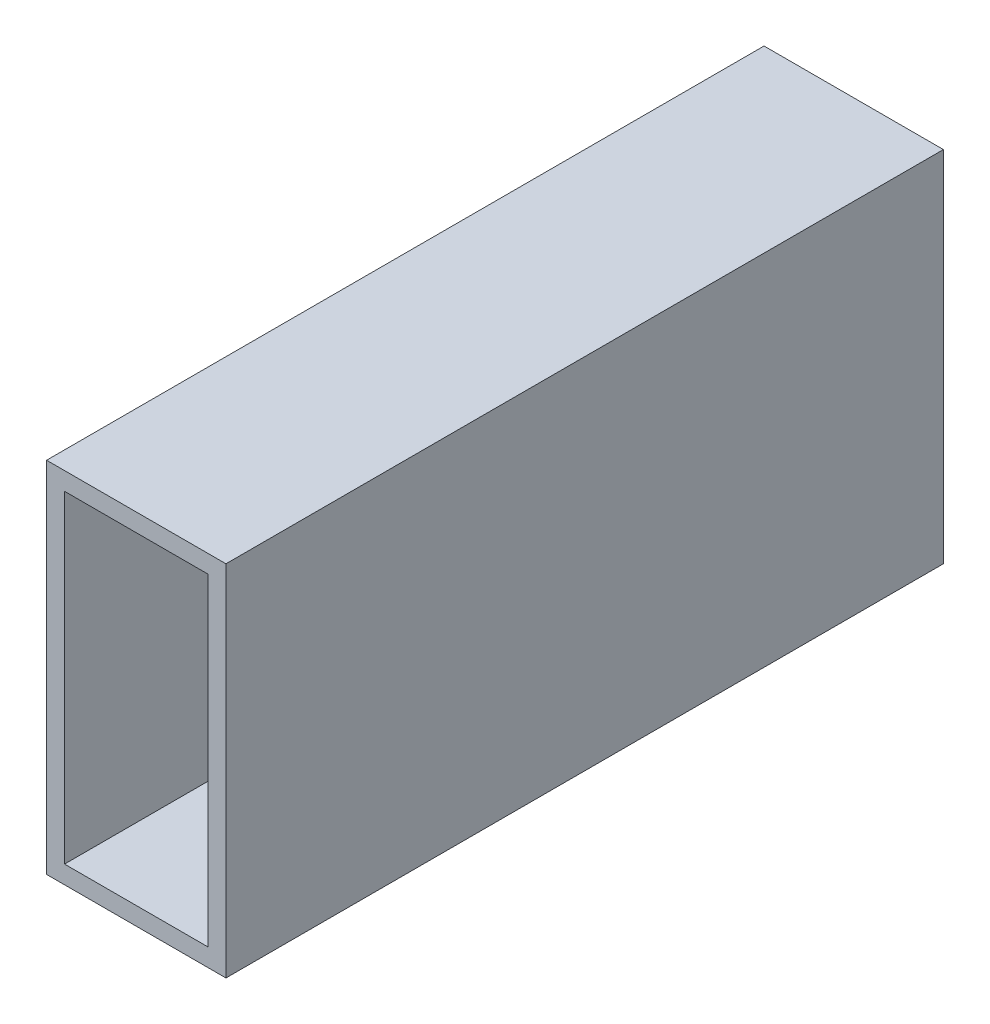
ISO-10303-21;
HEADER;
FILE_DESCRIPTION(('STEP AP214'),'2;1');
FILE_NAME('part.step','',(''),(''),'','','');
FILE_SCHEMA(('AUTOMOTIVE_DESIGN { 1 0 10303 214 1 1 1 1 }'));
ENDSEC;
DATA;
#1=APPLICATION_CONTEXT('core data for automotive mechanical design processes');
#2=APPLICATION_PROTOCOL_DEFINITION('international standard','automotive_design',2000,#1);
#3=PRODUCT_CONTEXT('',#1,'mechanical');
#4=PRODUCT('Part','Part','',(#3));
#5=PRODUCT_RELATED_PRODUCT_CATEGORY('part','',(#4));
#6=PRODUCT_DEFINITION_FORMATION('','',#4);
#7=PRODUCT_DEFINITION_CONTEXT('part definition',#1,'design');
#8=PRODUCT_DEFINITION('design','',#6,#7);
#9=PRODUCT_DEFINITION_SHAPE('','',#8);
#10=(LENGTH_UNIT() NAMED_UNIT(*) SI_UNIT(.MILLI.,.METRE.));
#11=(NAMED_UNIT(*) PLANE_ANGLE_UNIT() SI_UNIT($,.RADIAN.));
#12=(NAMED_UNIT(*) SI_UNIT($,.STERADIAN.) SOLID_ANGLE_UNIT());
#13=UNCERTAINTY_MEASURE_WITH_UNIT(LENGTH_MEASURE(1.E-05),#10,'distance_accuracy_value','');
#14=(GEOMETRIC_REPRESENTATION_CONTEXT(3) GLOBAL_UNCERTAINTY_ASSIGNED_CONTEXT((#13)) GLOBAL_UNIT_ASSIGNED_CONTEXT((#10,
#11,#12)) REPRESENTATION_CONTEXT('',''));
#15=CARTESIAN_POINT('',(0.,0.,0.));
#16=DIRECTION('',(0.,0.,1.));
#17=DIRECTION('',(1.,0.,0.));
#18=AXIS2_PLACEMENT_3D('',#15,#16,#17);
#19=CARTESIAN_POINT('',(0.,0.,100.));
#20=DIRECTION('',(0.,0.,1.));
#21=DIRECTION('',(1.,0.,0.));
#22=AXIS2_PLACEMENT_3D('',#19,#20,#21);
#23=PLANE('',#22);
#24=DIRECTION('',(0.,1.,0.));
#25=VECTOR('',#24,1.);
#26=CARTESIAN_POINT('',(12.5,25.,100.));
#27=LINE('',#26,#25);
#28=CARTESIAN_POINT('',(12.5,-25.,100.));
#29=VERTEX_POINT('',#28);
#30=CARTESIAN_POINT('',(12.5,25.,100.));
#31=VERTEX_POINT('',#30);
#32=EDGE_CURVE('E134',#29,#31,#27,.T.);
#33=ORIENTED_EDGE('',*,*,#32,.T.);
#34=DIRECTION('',(-1.,0.,0.));
#35=VECTOR('',#34,1.);
#36=CARTESIAN_POINT('',(-12.5,25.,100.));
#37=LINE('',#36,#35);
#38=CARTESIAN_POINT('',(-12.5,25.,100.));
#39=VERTEX_POINT('',#38);
#40=EDGE_CURVE('E137',#31,#39,#37,.T.);
#41=ORIENTED_EDGE('',*,*,#40,.T.);
#42=DIRECTION('',(0.,-1.,0.));
#43=VECTOR('',#42,1.);
#44=CARTESIAN_POINT('',(-12.5,25.,100.));
#45=LINE('',#44,#43);
#46=CARTESIAN_POINT('',(-12.5,-25.,100.));
#47=VERTEX_POINT('',#46);
#48=EDGE_CURVE('E140',#39,#47,#45,.T.);
#49=ORIENTED_EDGE('',*,*,#48,.T.);
#50=DIRECTION('',(1.,0.,0.));
#51=VECTOR('',#50,1.);
#52=CARTESIAN_POINT('',(-12.5,-25.,100.));
#53=LINE('',#52,#51);
#54=EDGE_CURVE('E142',#47,#29,#53,.T.);
#55=ORIENTED_EDGE('',*,*,#54,.T.);
#56=EDGE_LOOP('',(#33,#41,#49,#55));
#57=FACE_BOUND('',#56,.T.);
#58=DIRECTION('',(-1.,0.,0.));
#59=VECTOR('',#58,1.);
#60=CARTESIAN_POINT('',(-10.,22.5,100.));
#61=LINE('',#60,#59);
#62=CARTESIAN_POINT('',(10.,22.5,100.));
#63=VERTEX_POINT('',#62);
#64=CARTESIAN_POINT('',(-10.,22.5,100.));
#65=VERTEX_POINT('',#64);
#66=EDGE_CURVE('E106',#63,#65,#61,.T.);
#67=ORIENTED_EDGE('',*,*,#66,.F.);
#68=DIRECTION('',(0.,1.,0.));
#69=VECTOR('',#68,1.);
#70=CARTESIAN_POINT('',(10.,22.5,100.));
#71=LINE('',#70,#69);
#72=CARTESIAN_POINT('',(10.,-22.5,100.));
#73=VERTEX_POINT('',#72);
#74=EDGE_CURVE('E98',#73,#63,#71,.T.);
#75=ORIENTED_EDGE('',*,*,#74,.F.);
#76=DIRECTION('',(1.,0.,0.));
#77=VECTOR('',#76,1.);
#78=CARTESIAN_POINT('',(-10.,-22.5,100.));
#79=LINE('',#78,#77);
#80=CARTESIAN_POINT('',(-10.,-22.5,100.));
#81=VERTEX_POINT('',#80);
#82=EDGE_CURVE('E120',#81,#73,#79,.T.);
#83=ORIENTED_EDGE('',*,*,#82,.F.);
#84=DIRECTION('',(0.,-1.,0.));
#85=VECTOR('',#84,1.);
#86=CARTESIAN_POINT('',(-10.,22.5,100.));
#87=LINE('',#86,#85);
#88=EDGE_CURVE('E118',#65,#81,#87,.T.);
#89=ORIENTED_EDGE('',*,*,#88,.F.);
#90=EDGE_LOOP('',(#67,#75,#83,#89));
#91=FACE_BOUND('',#90,.T.);
#92=ADVANCED_FACE('F33',(#57,#91),#23,.T.);
#93=CARTESIAN_POINT('',(0.,0.,0.));
#94=DIRECTION('',(0.,0.,1.));
#95=DIRECTION('',(1.,0.,0.));
#96=AXIS2_PLACEMENT_3D('',#93,#94,#95);
#97=PLANE('',#96);
#98=DIRECTION('',(0.,1.,0.));
#99=VECTOR('',#98,1.);
#100=CARTESIAN_POINT('',(12.5,25.,0.));
#101=LINE('',#100,#99);
#102=CARTESIAN_POINT('',(12.5,-25.,0.));
#103=VERTEX_POINT('',#102);
#104=CARTESIAN_POINT('',(12.5,25.,0.));
#105=VERTEX_POINT('',#104);
#106=EDGE_CURVE('E114',#103,#105,#101,.T.);
#107=ORIENTED_EDGE('',*,*,#106,.F.);
#108=DIRECTION('',(1.,0.,0.));
#109=VECTOR('',#108,1.);
#110=CARTESIAN_POINT('',(-12.5,-25.,0.));
#111=LINE('',#110,#109);
#112=CARTESIAN_POINT('',(-12.5,-25.,0.));
#113=VERTEX_POINT('',#112);
#114=EDGE_CURVE('E138',#113,#103,#111,.T.);
#115=ORIENTED_EDGE('',*,*,#114,.F.);
#116=DIRECTION('',(0.,-1.,0.));
#117=VECTOR('',#116,1.);
#118=CARTESIAN_POINT('',(-12.5,25.,0.));
#119=LINE('',#118,#117);
#120=CARTESIAN_POINT('',(-12.5,25.,0.));
#121=VERTEX_POINT('',#120);
#122=EDGE_CURVE('E149',#121,#113,#119,.T.);
#123=ORIENTED_EDGE('',*,*,#122,.F.);
#124=DIRECTION('',(-1.,0.,0.));
#125=VECTOR('',#124,1.);
#126=CARTESIAN_POINT('',(-12.5,25.,0.));
#127=LINE('',#126,#125);
#128=EDGE_CURVE('E147',#105,#121,#127,.T.);
#129=ORIENTED_EDGE('',*,*,#128,.F.);
#130=EDGE_LOOP('',(#107,#115,#123,#129));
#131=FACE_BOUND('',#130,.T.);
#132=DIRECTION('',(0.,1.,0.));
#133=VECTOR('',#132,1.);
#134=CARTESIAN_POINT('',(10.,22.5,0.));
#135=LINE('',#134,#133);
#136=CARTESIAN_POINT('',(10.,-22.5,0.));
#137=VERTEX_POINT('',#136);
#138=CARTESIAN_POINT('',(10.,22.5,0.));
#139=VERTEX_POINT('',#138);
#140=EDGE_CURVE('E56',#137,#139,#135,.T.);
#141=ORIENTED_EDGE('',*,*,#140,.T.);
#142=DIRECTION('',(-1.,0.,0.));
#143=VECTOR('',#142,1.);
#144=CARTESIAN_POINT('',(-10.,22.5,0.));
#145=LINE('',#144,#143);
#146=CARTESIAN_POINT('',(-10.,22.5,0.));
#147=VERTEX_POINT('',#146);
#148=EDGE_CURVE('E113',#139,#147,#145,.T.);
#149=ORIENTED_EDGE('',*,*,#148,.T.);
#150=DIRECTION('',(0.,-1.,0.));
#151=VECTOR('',#150,1.);
#152=CARTESIAN_POINT('',(-10.,22.5,0.));
#153=LINE('',#152,#151);
#154=CARTESIAN_POINT('',(-10.,-22.5,0.));
#155=VERTEX_POINT('',#154);
#156=EDGE_CURVE('E126',#147,#155,#153,.T.);
#157=ORIENTED_EDGE('',*,*,#156,.T.);
#158=DIRECTION('',(1.,0.,0.));
#159=VECTOR('',#158,1.);
#160=CARTESIAN_POINT('',(-10.,-22.5,0.));
#161=LINE('',#160,#159);
#162=EDGE_CURVE('E107',#155,#137,#161,.T.);
#163=ORIENTED_EDGE('',*,*,#162,.T.);
#164=EDGE_LOOP('',(#141,#149,#157,#163));
#165=FACE_BOUND('',#164,.T.);
#166=ADVANCED_FACE('F167',(#131,#165),#97,.F.);
#167=CARTESIAN_POINT('',(12.5,25.,100.));
#168=DIRECTION('',(-1.,0.,0.));
#169=DIRECTION('',(0.,-1.,0.));
#170=AXIS2_PLACEMENT_3D('',#167,#168,#169);
#171=PLANE('',#170);
#172=ORIENTED_EDGE('',*,*,#106,.T.);
#173=DIRECTION('',(0.,0.,-1.));
#174=VECTOR('',#173,1.);
#175=CARTESIAN_POINT('',(12.5,25.,100.));
#176=LINE('',#175,#174);
#177=EDGE_CURVE('E11',#31,#105,#176,.T.);
#178=ORIENTED_EDGE('',*,*,#177,.F.);
#179=ORIENTED_EDGE('',*,*,#32,.F.);
#180=DIRECTION('',(0.,0.,-1.));
#181=VECTOR('',#180,1.);
#182=CARTESIAN_POINT('',(12.5,-25.,100.));
#183=LINE('',#182,#181);
#184=EDGE_CURVE('E144',#29,#103,#183,.T.);
#185=ORIENTED_EDGE('',*,*,#184,.T.);
#186=EDGE_LOOP('',(#172,#178,#179,#185));
#187=FACE_BOUND('',#186,.T.);
#188=ADVANCED_FACE('F35',(#187),#171,.F.);
#189=CARTESIAN_POINT('',(-12.5,25.,100.));
#190=DIRECTION('',(0.,-1.,0.));
#191=DIRECTION('',(0.,0.,-1.));
#192=AXIS2_PLACEMENT_3D('',#189,#190,#191);
#193=PLANE('',#192);
#194=ORIENTED_EDGE('',*,*,#128,.T.);
#195=DIRECTION('',(0.,0.,-1.));
#196=VECTOR('',#195,1.);
#197=CARTESIAN_POINT('',(-12.5,25.,100.));
#198=LINE('',#197,#196);
#199=EDGE_CURVE('E41',#39,#121,#198,.T.);
#200=ORIENTED_EDGE('',*,*,#199,.F.);
#201=ORIENTED_EDGE('',*,*,#40,.F.);
#202=ORIENTED_EDGE('',*,*,#177,.T.);
#203=EDGE_LOOP('',(#194,#200,#201,#202));
#204=FACE_BOUND('',#203,.T.);
#205=ADVANCED_FACE('F177',(#204),#193,.F.);
#206=CARTESIAN_POINT('',(-12.5,25.,100.));
#207=DIRECTION('',(1.,0.,0.));
#208=DIRECTION('',(0.,1.,0.));
#209=AXIS2_PLACEMENT_3D('',#206,#207,#208);
#210=PLANE('',#209);
#211=ORIENTED_EDGE('',*,*,#122,.T.);
#212=DIRECTION('',(0.,0.,-1.));
#213=VECTOR('',#212,1.);
#214=CARTESIAN_POINT('',(-12.5,-25.,100.));
#215=LINE('',#214,#213);
#216=EDGE_CURVE('E154',#47,#113,#215,.T.);
#217=ORIENTED_EDGE('',*,*,#216,.F.);
#218=ORIENTED_EDGE('',*,*,#48,.F.);
#219=ORIENTED_EDGE('',*,*,#199,.T.);
#220=EDGE_LOOP('',(#211,#217,#218,#219));
#221=FACE_BOUND('',#220,.T.);
#222=ADVANCED_FACE('F161',(#221),#210,.F.);
#223=CARTESIAN_POINT('',(-12.5,-25.,100.));
#224=DIRECTION('',(0.,1.,0.));
#225=DIRECTION('',(0.,0.,1.));
#226=AXIS2_PLACEMENT_3D('',#223,#224,#225);
#227=PLANE('',#226);
#228=ORIENTED_EDGE('',*,*,#114,.T.);
#229=ORIENTED_EDGE('',*,*,#184,.F.);
#230=ORIENTED_EDGE('',*,*,#54,.F.);
#231=ORIENTED_EDGE('',*,*,#216,.T.);
#232=EDGE_LOOP('',(#228,#229,#230,#231));
#233=FACE_BOUND('',#232,.T.);
#234=ADVANCED_FACE('F171',(#233),#227,.F.);
#235=CARTESIAN_POINT('',(10.,22.5,100.));
#236=DIRECTION('',(-1.,0.,0.));
#237=DIRECTION('',(0.,0.,1.));
#238=AXIS2_PLACEMENT_3D('',#235,#236,#237);
#239=PLANE('',#238);
#240=ORIENTED_EDGE('',*,*,#140,.F.);
#241=DIRECTION('',(0.,0.,-1.));
#242=VECTOR('',#241,1.);
#243=CARTESIAN_POINT('',(10.,-22.5,100.));
#244=LINE('',#243,#242);
#245=EDGE_CURVE('E102',#73,#137,#244,.T.);
#246=ORIENTED_EDGE('',*,*,#245,.F.);
#247=ORIENTED_EDGE('',*,*,#74,.T.);
#248=DIRECTION('',(0.,0.,-1.));
#249=VECTOR('',#248,1.);
#250=CARTESIAN_POINT('',(10.,22.5,100.));
#251=LINE('',#250,#249);
#252=EDGE_CURVE('E101',#63,#139,#251,.T.);
#253=ORIENTED_EDGE('',*,*,#252,.T.);
#254=EDGE_LOOP('',(#240,#246,#247,#253));
#255=FACE_BOUND('',#254,.T.);
#256=ADVANCED_FACE('F100',(#255),#239,.T.);
#257=CARTESIAN_POINT('',(-10.,22.5,100.));
#258=DIRECTION('',(0.,-1.,0.));
#259=DIRECTION('',(0.,0.,-1.));
#260=AXIS2_PLACEMENT_3D('',#257,#258,#259);
#261=PLANE('',#260);
#262=ORIENTED_EDGE('',*,*,#148,.F.);
#263=ORIENTED_EDGE('',*,*,#252,.F.);
#264=ORIENTED_EDGE('',*,*,#66,.T.);
#265=DIRECTION('',(0.,0.,-1.));
#266=VECTOR('',#265,1.);
#267=CARTESIAN_POINT('',(-10.,22.5,100.));
#268=LINE('',#267,#266);
#269=EDGE_CURVE('E115',#65,#147,#268,.T.);
#270=ORIENTED_EDGE('',*,*,#269,.T.);
#271=EDGE_LOOP('',(#262,#263,#264,#270));
#272=FACE_BOUND('',#271,.T.);
#273=ADVANCED_FACE('F110',(#272),#261,.T.);
#274=CARTESIAN_POINT('',(-10.,22.5,100.));
#275=DIRECTION('',(1.,0.,0.));
#276=DIRECTION('',(0.,0.,-1.));
#277=AXIS2_PLACEMENT_3D('',#274,#275,#276);
#278=PLANE('',#277);
#279=ORIENTED_EDGE('',*,*,#156,.F.);
#280=ORIENTED_EDGE('',*,*,#269,.F.);
#281=ORIENTED_EDGE('',*,*,#88,.T.);
#282=DIRECTION('',(0.,0.,-1.));
#283=VECTOR('',#282,1.);
#284=CARTESIAN_POINT('',(-10.,-22.5,100.));
#285=LINE('',#284,#283);
#286=EDGE_CURVE('E48',#81,#155,#285,.T.);
#287=ORIENTED_EDGE('',*,*,#286,.T.);
#288=EDGE_LOOP('',(#279,#280,#281,#287));
#289=FACE_BOUND('',#288,.T.);
#290=ADVANCED_FACE('F200',(#289),#278,.T.);
#291=CARTESIAN_POINT('',(-10.,-22.5,100.));
#292=DIRECTION('',(0.,1.,0.));
#293=DIRECTION('',(0.,0.,1.));
#294=AXIS2_PLACEMENT_3D('',#291,#292,#293);
#295=PLANE('',#294);
#296=ORIENTED_EDGE('',*,*,#162,.F.);
#297=ORIENTED_EDGE('',*,*,#286,.F.);
#298=ORIENTED_EDGE('',*,*,#82,.T.);
#299=ORIENTED_EDGE('',*,*,#245,.T.);
#300=EDGE_LOOP('',(#296,#297,#298,#299));
#301=FACE_BOUND('',#300,.T.);
#302=ADVANCED_FACE('F204',(#301),#295,.T.);
#303=CLOSED_SHELL('',(#92,#166,#188,#205,#222,#234,#256,#273,#290,#302));
#304=MANIFOLD_SOLID_BREP('B2',#303);
#305=ADVANCED_BREP_SHAPE_REPRESENTATION('',(#18,#304),#14);
#306=SHAPE_DEFINITION_REPRESENTATION(#9,#305);
ENDSEC;
END-ISO-10303-21;
